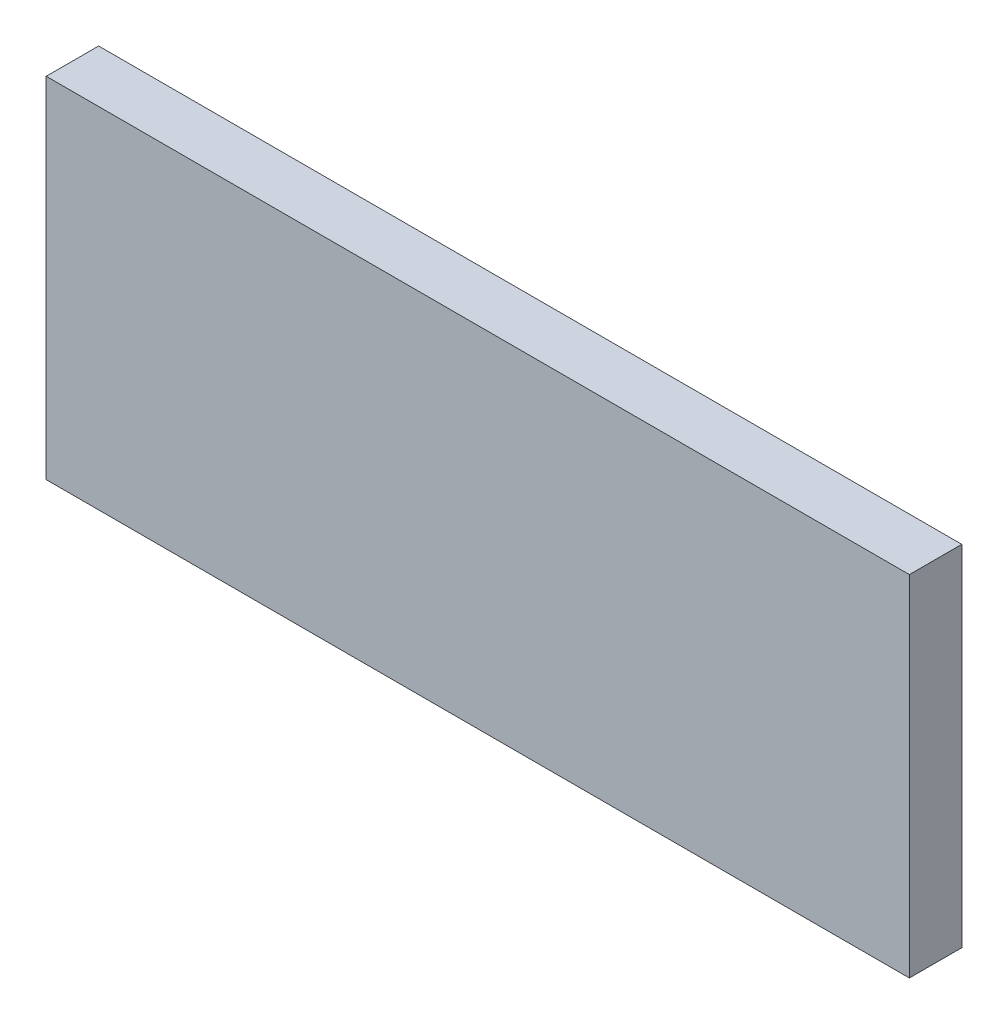
ISO-10303-21;
HEADER;
FILE_DESCRIPTION(('STEP AP214'),'2;1');
FILE_NAME('part.step','',(''),(''),'','','');
FILE_SCHEMA(('AUTOMOTIVE_DESIGN { 1 0 10303 214 1 1 1 1 }'));
ENDSEC;
DATA;
#1=APPLICATION_CONTEXT('core data for automotive mechanical design processes');
#2=APPLICATION_PROTOCOL_DEFINITION('international standard','automotive_design',2000,#1);
#3=PRODUCT_CONTEXT('',#1,'mechanical');
#4=PRODUCT('Part','Part','',(#3));
#5=PRODUCT_RELATED_PRODUCT_CATEGORY('part','',(#4));
#6=PRODUCT_DEFINITION_FORMATION('','',#4);
#7=PRODUCT_DEFINITION_CONTEXT('part definition',#1,'design');
#8=PRODUCT_DEFINITION('design','',#6,#7);
#9=PRODUCT_DEFINITION_SHAPE('','',#8);
#10=(LENGTH_UNIT() NAMED_UNIT(*) SI_UNIT(.MILLI.,.METRE.));
#11=(NAMED_UNIT(*) PLANE_ANGLE_UNIT() SI_UNIT($,.RADIAN.));
#12=(NAMED_UNIT(*) SI_UNIT($,.STERADIAN.) SOLID_ANGLE_UNIT());
#13=UNCERTAINTY_MEASURE_WITH_UNIT(LENGTH_MEASURE(1.E-05),#10,'distance_accuracy_value','');
#14=(GEOMETRIC_REPRESENTATION_CONTEXT(3) GLOBAL_UNCERTAINTY_ASSIGNED_CONTEXT((#13)) GLOBAL_UNIT_ASSIGNED_CONTEXT((#10,
#11,#12)) REPRESENTATION_CONTEXT('',''));
#15=CARTESIAN_POINT('',(0.,0.,0.));
#16=DIRECTION('',(0.,0.,1.));
#17=DIRECTION('',(1.,0.,0.));
#18=AXIS2_PLACEMENT_3D('',#15,#16,#17);
#19=CARTESIAN_POINT('',(395.859,340.233,1.6194));
#20=DIRECTION('',(1.,0.,0.));
#21=DIRECTION('',(0.,0.,-1.));
#22=AXIS2_PLACEMENT_3D('',#19,#20,#21);
#23=PLANE('',#22);
#24=DIRECTION('',(0.,-1.,0.));
#25=VECTOR('',#24,1.);
#26=CARTESIAN_POINT('',(395.859,340.233,0.));
#27=LINE('',#26,#25);
#28=CARTESIAN_POINT('',(395.859,340.233,0.));
#29=VERTEX_POINT('',#28);
#30=CARTESIAN_POINT('',(395.859,329.438,0.));
#31=VERTEX_POINT('',#30);
#32=EDGE_CURVE('E108',#29,#31,#27,.T.);
#33=ORIENTED_EDGE('',*,*,#32,.T.);
#34=DIRECTION('',(0.,0.,-1.));
#35=VECTOR('',#34,1.);
#36=CARTESIAN_POINT('',(395.859,329.438,1.6194));
#37=LINE('',#36,#35);
#38=CARTESIAN_POINT('',(395.859,329.438,1.6194));
#39=VERTEX_POINT('',#38);
#40=EDGE_CURVE('E11',#39,#31,#37,.T.);
#41=ORIENTED_EDGE('',*,*,#40,.F.);
#42=DIRECTION('',(0.,-1.,0.));
#43=VECTOR('',#42,1.);
#44=CARTESIAN_POINT('',(395.859,340.233,1.6194));
#45=LINE('',#44,#43);
#46=CARTESIAN_POINT('',(395.859,340.233,1.6194));
#47=VERTEX_POINT('',#46);
#48=EDGE_CURVE('E96',#47,#39,#45,.T.);
#49=ORIENTED_EDGE('',*,*,#48,.F.);
#50=DIRECTION('',(0.,0.,-1.));
#51=VECTOR('',#50,1.);
#52=CARTESIAN_POINT('',(395.859,340.233,1.6194));
#53=LINE('',#52,#51);
#54=EDGE_CURVE('E104',#47,#29,#53,.T.);
#55=ORIENTED_EDGE('',*,*,#54,.T.);
#56=EDGE_LOOP('',(#33,#41,#49,#55));
#57=FACE_BOUND('',#56,.T.);
#58=ADVANCED_FACE('F45',(#57),#23,.F.);
#59=CARTESIAN_POINT('',(395.859,329.438,1.6194));
#60=DIRECTION('',(0.,1.,0.));
#61=DIRECTION('',(0.,0.,1.));
#62=AXIS2_PLACEMENT_3D('',#59,#60,#61);
#63=PLANE('',#62);
#64=DIRECTION('',(1.,0.,0.));
#65=VECTOR('',#64,1.);
#66=CARTESIAN_POINT('',(395.859,329.438,0.));
#67=LINE('',#66,#65);
#68=CARTESIAN_POINT('',(422.529,329.438,0.));
#69=VERTEX_POINT('',#68);
#70=EDGE_CURVE('E100',#31,#69,#67,.T.);
#71=ORIENTED_EDGE('',*,*,#70,.T.);
#72=DIRECTION('',(0.,0.,-1.));
#73=VECTOR('',#72,1.);
#74=CARTESIAN_POINT('',(422.529,329.438,1.6194));
#75=LINE('',#74,#73);
#76=CARTESIAN_POINT('',(422.529,329.438,1.6194));
#77=VERTEX_POINT('',#76);
#78=EDGE_CURVE('E53',#77,#69,#75,.T.);
#79=ORIENTED_EDGE('',*,*,#78,.F.);
#80=DIRECTION('',(1.,0.,0.));
#81=VECTOR('',#80,1.);
#82=CARTESIAN_POINT('',(395.859,329.438,1.6194));
#83=LINE('',#82,#81);
#84=EDGE_CURVE('E91',#39,#77,#83,.T.);
#85=ORIENTED_EDGE('',*,*,#84,.F.);
#86=ORIENTED_EDGE('',*,*,#40,.T.);
#87=EDGE_LOOP('',(#71,#79,#85,#86));
#88=FACE_BOUND('',#87,.T.);
#89=ADVANCED_FACE('F99',(#88),#63,.F.);
#90=CARTESIAN_POINT('',(422.529,329.438,1.6194));
#91=DIRECTION('',(-1.,0.,0.));
#92=DIRECTION('',(0.,0.,1.));
#93=AXIS2_PLACEMENT_3D('',#90,#91,#92);
#94=PLANE('',#93);
#95=DIRECTION('',(0.,1.,0.));
#96=VECTOR('',#95,1.);
#97=CARTESIAN_POINT('',(422.529,329.438,0.));
#98=LINE('',#97,#96);
#99=CARTESIAN_POINT('',(422.529,340.233,0.));
#100=VERTEX_POINT('',#99);
#101=EDGE_CURVE('E78',#69,#100,#98,.T.);
#102=ORIENTED_EDGE('',*,*,#101,.T.);
#103=DIRECTION('',(0.,0.,-1.));
#104=VECTOR('',#103,1.);
#105=CARTESIAN_POINT('',(422.529,340.233,1.6194));
#106=LINE('',#105,#104);
#107=CARTESIAN_POINT('',(422.529,340.233,1.6194));
#108=VERTEX_POINT('',#107);
#109=EDGE_CURVE('E101',#108,#100,#106,.T.);
#110=ORIENTED_EDGE('',*,*,#109,.F.);
#111=DIRECTION('',(0.,1.,0.));
#112=VECTOR('',#111,1.);
#113=CARTESIAN_POINT('',(422.529,329.438,1.6194));
#114=LINE('',#113,#112);
#115=EDGE_CURVE('E94',#77,#108,#114,.T.);
#116=ORIENTED_EDGE('',*,*,#115,.F.);
#117=ORIENTED_EDGE('',*,*,#78,.T.);
#118=EDGE_LOOP('',(#102,#110,#116,#117));
#119=FACE_BOUND('',#118,.T.);
#120=ADVANCED_FACE('F102',(#119),#94,.F.);
#121=CARTESIAN_POINT('',(422.529,340.233,1.6194));
#122=DIRECTION('',(0.,-1.,0.));
#123=DIRECTION('',(0.,0.,-1.));
#124=AXIS2_PLACEMENT_3D('',#121,#122,#123);
#125=PLANE('',#124);
#126=DIRECTION('',(-1.,0.,0.));
#127=VECTOR('',#126,1.);
#128=CARTESIAN_POINT('',(422.529,340.233,0.));
#129=LINE('',#128,#127);
#130=EDGE_CURVE('E84',#100,#29,#129,.T.);
#131=ORIENTED_EDGE('',*,*,#130,.T.);
#132=ORIENTED_EDGE('',*,*,#54,.F.);
#133=DIRECTION('',(-1.,0.,0.));
#134=VECTOR('',#133,1.);
#135=CARTESIAN_POINT('',(422.529,340.233,1.6194));
#136=LINE('',#135,#134);
#137=EDGE_CURVE('E61',#108,#47,#136,.T.);
#138=ORIENTED_EDGE('',*,*,#137,.F.);
#139=ORIENTED_EDGE('',*,*,#109,.T.);
#140=EDGE_LOOP('',(#131,#132,#138,#139));
#141=FACE_BOUND('',#140,.T.);
#142=ADVANCED_FACE('F115',(#141),#125,.F.);
#143=CARTESIAN_POINT('',(0.,0.,1.6194));
#144=DIRECTION('',(0.,0.,1.));
#145=DIRECTION('',(1.,0.,0.));
#146=AXIS2_PLACEMENT_3D('',#143,#144,#145);
#147=PLANE('',#146);
#148=ORIENTED_EDGE('',*,*,#48,.T.);
#149=ORIENTED_EDGE('',*,*,#84,.T.);
#150=ORIENTED_EDGE('',*,*,#115,.T.);
#151=ORIENTED_EDGE('',*,*,#137,.T.);
#152=EDGE_LOOP('',(#148,#149,#150,#151));
#153=FACE_BOUND('',#152,.T.);
#154=ADVANCED_FACE('F92',(#153),#147,.T.);
#155=CARTESIAN_POINT('',(0.,0.,0.));
#156=DIRECTION('',(0.,0.,1.));
#157=DIRECTION('',(1.,0.,0.));
#158=AXIS2_PLACEMENT_3D('',#155,#156,#157);
#159=PLANE('',#158);
#160=ORIENTED_EDGE('',*,*,#32,.F.);
#161=ORIENTED_EDGE('',*,*,#130,.F.);
#162=ORIENTED_EDGE('',*,*,#101,.F.);
#163=ORIENTED_EDGE('',*,*,#70,.F.);
#164=EDGE_LOOP('',(#160,#161,#162,#163));
#165=FACE_BOUND('',#164,.T.);
#166=ADVANCED_FACE('F118',(#165),#159,.F.);
#167=CLOSED_SHELL('',(#58,#89,#120,#142,#154,#166));
#168=MANIFOLD_SOLID_BREP('B2',#167);
#169=ADVANCED_BREP_SHAPE_REPRESENTATION('',(#18,#168),#14);
#170=SHAPE_DEFINITION_REPRESENTATION(#9,#169);
ENDSEC;
END-ISO-10303-21;
